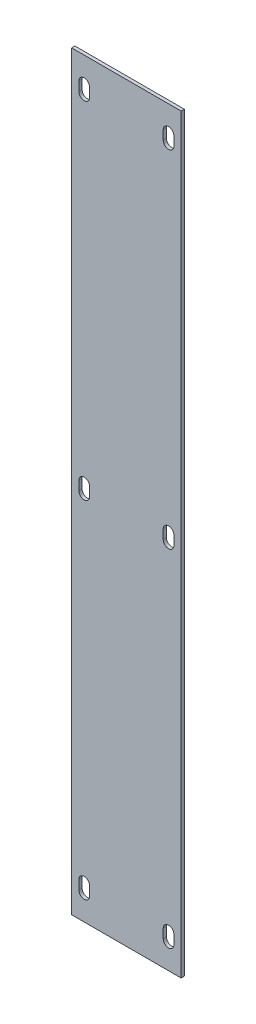
ISO-10303-21;
HEADER;
FILE_DESCRIPTION(('STEP AP214'),'2;1');
FILE_NAME('part.step','',(''),(''),'','','');
FILE_SCHEMA(('AUTOMOTIVE_DESIGN { 1 0 10303 214 1 1 1 1 }'));
ENDSEC;
DATA;
#1=APPLICATION_CONTEXT('core data for automotive mechanical design processes');
#2=APPLICATION_PROTOCOL_DEFINITION('international standard','automotive_design',2000,#1);
#3=PRODUCT_CONTEXT('',#1,'mechanical');
#4=PRODUCT('Part','Part','',(#3));
#5=PRODUCT_RELATED_PRODUCT_CATEGORY('part','',(#4));
#6=PRODUCT_DEFINITION_FORMATION('','',#4);
#7=PRODUCT_DEFINITION_CONTEXT('part definition',#1,'design');
#8=PRODUCT_DEFINITION('design','',#6,#7);
#9=PRODUCT_DEFINITION_SHAPE('','',#8);
#10=(LENGTH_UNIT() NAMED_UNIT(*) SI_UNIT(.MILLI.,.METRE.));
#11=(NAMED_UNIT(*) PLANE_ANGLE_UNIT() SI_UNIT($,.RADIAN.));
#12=(NAMED_UNIT(*) SI_UNIT($,.STERADIAN.) SOLID_ANGLE_UNIT());
#13=UNCERTAINTY_MEASURE_WITH_UNIT(LENGTH_MEASURE(1.E-05),#10,'distance_accuracy_value','');
#14=(GEOMETRIC_REPRESENTATION_CONTEXT(3) GLOBAL_UNCERTAINTY_ASSIGNED_CONTEXT((#13)) GLOBAL_UNIT_ASSIGNED_CONTEXT((#10,
#11,#12)) REPRESENTATION_CONTEXT('',''));
#15=CARTESIAN_POINT('',(0.,0.,0.));
#16=DIRECTION('',(0.,0.,1.));
#17=DIRECTION('',(1.,0.,0.));
#18=AXIS2_PLACEMENT_3D('',#15,#16,#17);
#19=CARTESIAN_POINT('',(-13.85,190.09,-0.4064));
#20=DIRECTION('',(0.,0.,1.));
#21=DIRECTION('',(1.,0.,0.));
#22=AXIS2_PLACEMENT_3D('',#19,#20,#21);
#23=PLANE('',#22);
#24=CARTESIAN_POINT('',(-10.675,8.65,-0.406400000000001));
#25=DIRECTION('',(0.,0.,-1.));
#26=DIRECTION('',(-1.,0.,0.));
#27=AXIS2_PLACEMENT_3D('',#24,#25,#26);
#28=CIRCLE('',#27,1.34999999999999);
#29=CARTESIAN_POINT('',(-12.025,8.65,-0.4064));
#30=VERTEX_POINT('',#29);
#31=CARTESIAN_POINT('',(-9.32500000000002,8.65,-0.406400000000001));
#32=VERTEX_POINT('',#31);
#33=EDGE_CURVE('E734',#30,#32,#28,.T.);
#34=ORIENTED_EDGE('',*,*,#33,.F.);
#35=DIRECTION('',(0.,1.,0.));
#36=VECTOR('',#35,1.);
#37=CARTESIAN_POINT('',(-12.025,6.35,-0.4064));
#38=LINE('',#37,#36);
#39=CARTESIAN_POINT('',(-12.025,6.34999999999999,-0.4064));
#40=VERTEX_POINT('',#39);
#41=EDGE_CURVE('E712',#40,#30,#38,.T.);
#42=ORIENTED_EDGE('',*,*,#41,.F.);
#43=CARTESIAN_POINT('',(-10.675,6.35,-0.406400000000001));
#44=DIRECTION('',(0.,0.,-1.));
#45=DIRECTION('',(-1.,0.,0.));
#46=AXIS2_PLACEMENT_3D('',#43,#44,#45);
#47=CIRCLE('',#46,1.34999999999999);
#48=CARTESIAN_POINT('',(-9.32500000000002,6.35,-0.406400000000001));
#49=VERTEX_POINT('',#48);
#50=EDGE_CURVE('E723',#49,#40,#47,.T.);
#51=ORIENTED_EDGE('',*,*,#50,.F.);
#52=DIRECTION('',(0.,1.,0.));
#53=VECTOR('',#52,1.);
#54=CARTESIAN_POINT('',(-9.32500000000002,6.35,-0.406400000000001));
#55=LINE('',#54,#53);
#56=EDGE_CURVE('E715',#49,#32,#55,.T.);
#57=ORIENTED_EDGE('',*,*,#56,.T.);
#58=EDGE_LOOP('',(#34,#42,#51,#57));
#59=FACE_BOUND('',#58,.T.);
#60=DIRECTION('',(0.,1.,0.));
#61=VECTOR('',#60,1.);
#62=CARTESIAN_POINT('',(-12.025,181.44,-0.4064));
#63=LINE('',#62,#61);
#64=CARTESIAN_POINT('',(-12.025,181.44,-0.406400000000001));
#65=VERTEX_POINT('',#64);
#66=CARTESIAN_POINT('',(-12.025,183.74,-0.4064));
#67=VERTEX_POINT('',#66);
#68=EDGE_CURVE('E768',#65,#67,#63,.T.);
#69=ORIENTED_EDGE('',*,*,#68,.F.);
#70=CARTESIAN_POINT('',(-10.675,181.44,-0.406400000000001));
#71=DIRECTION('',(0.,0.,-1.));
#72=DIRECTION('',(-1.,0.,0.));
#73=AXIS2_PLACEMENT_3D('',#70,#71,#72);
#74=CIRCLE('',#73,1.34999999999999);
#75=CARTESIAN_POINT('',(-9.32500000000002,181.44,-0.406400000000001));
#76=VERTEX_POINT('',#75);
#77=EDGE_CURVE('E779',#76,#65,#74,.T.);
#78=ORIENTED_EDGE('',*,*,#77,.F.);
#79=DIRECTION('',(0.,1.,0.));
#80=VECTOR('',#79,1.);
#81=CARTESIAN_POINT('',(-9.32500000000002,181.44,-0.406400000000001));
#82=LINE('',#81,#80);
#83=CARTESIAN_POINT('',(-9.32500000000002,183.74,-0.406400000000001));
#84=VERTEX_POINT('',#83);
#85=EDGE_CURVE('E771',#76,#84,#82,.T.);
#86=ORIENTED_EDGE('',*,*,#85,.T.);
#87=CARTESIAN_POINT('',(-10.675,183.74,-0.406400000000001));
#88=DIRECTION('',(0.,0.,-1.));
#89=DIRECTION('',(-1.,0.,0.));
#90=AXIS2_PLACEMENT_3D('',#87,#88,#89);
#91=CIRCLE('',#90,1.34999999999999);
#92=EDGE_CURVE('E790',#67,#84,#91,.T.);
#93=ORIENTED_EDGE('',*,*,#92,.F.);
#94=EDGE_LOOP('',(#69,#78,#86,#93));
#95=FACE_BOUND('',#94,.T.);
#96=CARTESIAN_POINT('',(10.675,96.195,-0.406400000000001));
#97=DIRECTION('',(0.,0.,-1.));
#98=DIRECTION('',(-1.,0.,0.));
#99=AXIS2_PLACEMENT_3D('',#96,#97,#98);
#100=CIRCLE('',#99,1.34999999999999);
#101=CARTESIAN_POINT('',(9.32499999999997,96.195,-0.4064));
#102=VERTEX_POINT('',#101);
#103=CARTESIAN_POINT('',(12.025,96.195,-0.406400000000001));
#104=VERTEX_POINT('',#103);
#105=EDGE_CURVE('E818',#102,#104,#100,.T.);
#106=ORIENTED_EDGE('',*,*,#105,.F.);
#107=DIRECTION('',(0.,1.,0.));
#108=VECTOR('',#107,1.);
#109=CARTESIAN_POINT('',(9.32499999999997,93.895,-0.4064));
#110=LINE('',#109,#108);
#111=CARTESIAN_POINT('',(9.32500000000001,93.895,-0.406400000000001));
#112=VERTEX_POINT('',#111);
#113=EDGE_CURVE('E796',#112,#102,#110,.T.);
#114=ORIENTED_EDGE('',*,*,#113,.F.);
#115=CARTESIAN_POINT('',(10.675,93.895,-0.406400000000001));
#116=DIRECTION('',(0.,0.,-1.));
#117=DIRECTION('',(-1.,0.,0.));
#118=AXIS2_PLACEMENT_3D('',#115,#116,#117);
#119=CIRCLE('',#118,1.34999999999999);
#120=CARTESIAN_POINT('',(12.025,93.895,-0.406400000000001));
#121=VERTEX_POINT('',#120);
#122=EDGE_CURVE('E807',#121,#112,#119,.T.);
#123=ORIENTED_EDGE('',*,*,#122,.F.);
#124=DIRECTION('',(0.,1.,0.));
#125=VECTOR('',#124,1.);
#126=CARTESIAN_POINT('',(12.025,93.895,-0.406400000000001));
#127=LINE('',#126,#125);
#128=EDGE_CURVE('E799',#121,#104,#127,.T.);
#129=ORIENTED_EDGE('',*,*,#128,.T.);
#130=EDGE_LOOP('',(#106,#114,#123,#129));
#131=FACE_BOUND('',#130,.T.);
#132=DIRECTION('',(-1.,0.,0.));
#133=VECTOR('',#132,1.);
#134=CARTESIAN_POINT('',(-13.85,0.,-0.4064));
#135=LINE('',#134,#133);
#136=CARTESIAN_POINT('',(13.85,0.,-0.4064));
#137=VERTEX_POINT('',#136);
#138=CARTESIAN_POINT('',(-13.85,0.,-0.4064));
#139=VERTEX_POINT('',#138);
#140=EDGE_CURVE('E872',#137,#139,#135,.T.);
#141=ORIENTED_EDGE('',*,*,#140,.T.);
#142=DIRECTION('',(0.,-1.,0.));
#143=VECTOR('',#142,1.);
#144=CARTESIAN_POINT('',(-13.85,190.09,-0.4064));
#145=LINE('',#144,#143);
#146=CARTESIAN_POINT('',(-13.85,190.09,-0.4064));
#147=VERTEX_POINT('',#146);
#148=EDGE_CURVE('E887',#147,#139,#145,.T.);
#149=ORIENTED_EDGE('',*,*,#148,.F.);
#150=DIRECTION('',(-1.,0.,0.));
#151=VECTOR('',#150,1.);
#152=CARTESIAN_POINT('',(-13.85,190.09,-0.4064));
#153=LINE('',#152,#151);
#154=CARTESIAN_POINT('',(13.85,190.09,-0.4064));
#155=VERTEX_POINT('',#154);
#156=EDGE_CURVE('E858',#155,#147,#153,.T.);
#157=ORIENTED_EDGE('',*,*,#156,.F.);
#158=DIRECTION('',(0.,-1.,0.));
#159=VECTOR('',#158,1.);
#160=CARTESIAN_POINT('',(13.85,190.09,-0.4064));
#161=LINE('',#160,#159);
#162=EDGE_CURVE('E891',#155,#137,#161,.T.);
#163=ORIENTED_EDGE('',*,*,#162,.T.);
#164=EDGE_LOOP('',(#141,#149,#157,#163));
#165=FACE_BOUND('',#164,.T.);
#166=CARTESIAN_POINT('',(-10.675,96.195,-0.406400000000001));
#167=DIRECTION('',(0.,0.,-1.));
#168=DIRECTION('',(-1.,0.,0.));
#169=AXIS2_PLACEMENT_3D('',#166,#167,#168);
#170=CIRCLE('',#169,1.34999999999999);
#171=CARTESIAN_POINT('',(-12.025,96.195,-0.4064));
#172=VERTEX_POINT('',#171);
#173=CARTESIAN_POINT('',(-9.32500000000002,96.195,-0.406400000000001));
#174=VERTEX_POINT('',#173);
#175=EDGE_CURVE('E847',#172,#174,#170,.T.);
#176=ORIENTED_EDGE('',*,*,#175,.F.);
#177=DIRECTION('',(0.,1.,0.));
#178=VECTOR('',#177,1.);
#179=CARTESIAN_POINT('',(-12.025,93.895,-0.4064));
#180=LINE('',#179,#178);
#181=CARTESIAN_POINT('',(-12.025,93.895,-0.406400000000001));
#182=VERTEX_POINT('',#181);
#183=EDGE_CURVE('E825',#182,#172,#180,.T.);
#184=ORIENTED_EDGE('',*,*,#183,.F.);
#185=CARTESIAN_POINT('',(-10.675,93.895,-0.406400000000001));
#186=DIRECTION('',(0.,0.,-1.));
#187=DIRECTION('',(-1.,0.,0.));
#188=AXIS2_PLACEMENT_3D('',#185,#186,#187);
#189=CIRCLE('',#188,1.34999999999999);
#190=CARTESIAN_POINT('',(-9.32500000000002,93.895,-0.406400000000001));
#191=VERTEX_POINT('',#190);
#192=EDGE_CURVE('E836',#191,#182,#189,.T.);
#193=ORIENTED_EDGE('',*,*,#192,.F.);
#194=DIRECTION('',(0.,1.,0.));
#195=VECTOR('',#194,1.);
#196=CARTESIAN_POINT('',(-9.32500000000002,93.895,-0.406400000000001));
#197=LINE('',#196,#195);
#198=EDGE_CURVE('E828',#191,#174,#197,.T.);
#199=ORIENTED_EDGE('',*,*,#198,.T.);
#200=EDGE_LOOP('',(#176,#184,#193,#199));
#201=FACE_BOUND('',#200,.T.);
#202=DIRECTION('',(0.,1.,0.));
#203=VECTOR('',#202,1.);
#204=CARTESIAN_POINT('',(9.32499999999997,181.44,-0.4064));
#205=LINE('',#204,#203);
#206=CARTESIAN_POINT('',(9.325,181.44,-0.406400000000001));
#207=VERTEX_POINT('',#206);
#208=CARTESIAN_POINT('',(9.32499999999997,183.74,-0.4064));
#209=VERTEX_POINT('',#208);
#210=EDGE_CURVE('E740',#207,#209,#205,.T.);
#211=ORIENTED_EDGE('',*,*,#210,.F.);
#212=CARTESIAN_POINT('',(10.675,181.44,-0.406400000000001));
#213=DIRECTION('',(0.,0.,-1.));
#214=DIRECTION('',(-1.,0.,0.));
#215=AXIS2_PLACEMENT_3D('',#212,#213,#214);
#216=CIRCLE('',#215,1.34999999999999);
#217=CARTESIAN_POINT('',(12.025,181.44,-0.406400000000001));
#218=VERTEX_POINT('',#217);
#219=EDGE_CURVE('E751',#218,#207,#216,.T.);
#220=ORIENTED_EDGE('',*,*,#219,.F.);
#221=DIRECTION('',(0.,1.,0.));
#222=VECTOR('',#221,1.);
#223=CARTESIAN_POINT('',(12.025,181.44,-0.406400000000001));
#224=LINE('',#223,#222);
#225=CARTESIAN_POINT('',(12.025,183.74,-0.406400000000001));
#226=VERTEX_POINT('',#225);
#227=EDGE_CURVE('E743',#218,#226,#224,.T.);
#228=ORIENTED_EDGE('',*,*,#227,.T.);
#229=CARTESIAN_POINT('',(10.675,183.74,-0.406400000000001));
#230=DIRECTION('',(0.,0.,-1.));
#231=DIRECTION('',(-1.,0.,0.));
#232=AXIS2_PLACEMENT_3D('',#229,#230,#231);
#233=CIRCLE('',#232,1.34999999999999);
#234=EDGE_CURVE('E762',#209,#226,#233,.T.);
#235=ORIENTED_EDGE('',*,*,#234,.F.);
#236=EDGE_LOOP('',(#211,#220,#228,#235));
#237=FACE_BOUND('',#236,.T.);
#238=DIRECTION('',(0.,1.,0.));
#239=VECTOR('',#238,1.);
#240=CARTESIAN_POINT('',(9.32499999999997,6.35,-0.4064));
#241=LINE('',#240,#239);
#242=CARTESIAN_POINT('',(9.325,6.35,-0.406400000000001));
#243=VERTEX_POINT('',#242);
#244=CARTESIAN_POINT('',(9.32499999999997,8.65,-0.4064));
#245=VERTEX_POINT('',#244);
#246=EDGE_CURVE('E699',#243,#245,#241,.T.);
#247=ORIENTED_EDGE('',*,*,#246,.F.);
#248=CARTESIAN_POINT('',(10.675,6.35,-0.406400000000001));
#249=DIRECTION('',(0.,0.,-1.));
#250=DIRECTION('',(-1.,0.,0.));
#251=AXIS2_PLACEMENT_3D('',#248,#249,#250);
#252=CIRCLE('',#251,1.34999999999999);
#253=CARTESIAN_POINT('',(12.025,6.35,-0.406400000000001));
#254=VERTEX_POINT('',#253);
#255=EDGE_CURVE('E697',#254,#243,#252,.T.);
#256=ORIENTED_EDGE('',*,*,#255,.F.);
#257=DIRECTION('',(0.,1.,0.));
#258=VECTOR('',#257,1.);
#259=CARTESIAN_POINT('',(12.025,6.35,-0.406400000000001));
#260=LINE('',#259,#258);
#261=CARTESIAN_POINT('',(12.025,8.65,-0.406400000000001));
#262=VERTEX_POINT('',#261);
#263=EDGE_CURVE('E692',#254,#262,#260,.T.);
#264=ORIENTED_EDGE('',*,*,#263,.T.);
#265=CARTESIAN_POINT('',(10.675,8.65,-0.406400000000001));
#266=DIRECTION('',(0.,0.,-1.));
#267=DIRECTION('',(-1.,0.,0.));
#268=AXIS2_PLACEMENT_3D('',#265,#266,#267);
#269=CIRCLE('',#268,1.34999999999999);
#270=EDGE_CURVE('E678',#245,#262,#269,.T.);
#271=ORIENTED_EDGE('',*,*,#270,.F.);
#272=EDGE_LOOP('',(#247,#256,#264,#271));
#273=FACE_BOUND('',#272,.T.);
#274=ADVANCED_FACE('F487',(#59,#95,#131,#165,#201,#237,#273),#23,.F.);
#275=CARTESIAN_POINT('',(-13.85,190.09,0.4064));
#276=DIRECTION('',(0.,0.,-1.));
#277=DIRECTION('',(-1.,0.,0.));
#278=AXIS2_PLACEMENT_3D('',#275,#276,#277);
#279=PLANE('',#278);
#280=DIRECTION('',(0.,1.,0.));
#281=VECTOR('',#280,1.);
#282=CARTESIAN_POINT('',(-9.32500000000001,190.09,0.4064));
#283=LINE('',#282,#281);
#284=CARTESIAN_POINT('',(-9.32500000000001,6.35,0.4064));
#285=VERTEX_POINT('',#284);
#286=CARTESIAN_POINT('',(-9.32500000000001,8.65,0.4064));
#287=VERTEX_POINT('',#286);
#288=EDGE_CURVE('E967',#285,#287,#283,.T.);
#289=ORIENTED_EDGE('',*,*,#288,.F.);
#290=CARTESIAN_POINT('',(-10.675,6.35,0.4064));
#291=DIRECTION('',(0.,0.,-1.));
#292=DIRECTION('',(-1.,0.,0.));
#293=AXIS2_PLACEMENT_3D('',#290,#291,#292);
#294=CIRCLE('',#293,1.34999999999999);
#295=CARTESIAN_POINT('',(-12.025,6.35,0.4064));
#296=VERTEX_POINT('',#295);
#297=EDGE_CURVE('E959',#285,#296,#294,.T.);
#298=ORIENTED_EDGE('',*,*,#297,.T.);
#299=DIRECTION('',(0.,1.,0.));
#300=VECTOR('',#299,1.);
#301=CARTESIAN_POINT('',(-12.025,190.09,0.4064));
#302=LINE('',#301,#300);
#303=CARTESIAN_POINT('',(-12.025,8.64999999999999,0.4064));
#304=VERTEX_POINT('',#303);
#305=EDGE_CURVE('E955',#296,#304,#302,.T.);
#306=ORIENTED_EDGE('',*,*,#305,.T.);
#307=CARTESIAN_POINT('',(-10.675,8.65,0.4064));
#308=DIRECTION('',(0.,0.,-1.));
#309=DIRECTION('',(-1.,0.,0.));
#310=AXIS2_PLACEMENT_3D('',#307,#308,#309);
#311=CIRCLE('',#310,1.34999999999999);
#312=EDGE_CURVE('E963',#304,#287,#311,.T.);
#313=ORIENTED_EDGE('',*,*,#312,.T.);
#314=EDGE_LOOP('',(#289,#298,#306,#313));
#315=FACE_BOUND('',#314,.T.);
#316=DIRECTION('',(0.,1.,0.));
#317=VECTOR('',#316,1.);
#318=CARTESIAN_POINT('',(-9.32500000000001,190.09,0.4064));
#319=LINE('',#318,#317);
#320=CARTESIAN_POINT('',(-9.32500000000001,181.44,0.4064));
#321=VERTEX_POINT('',#320);
#322=CARTESIAN_POINT('',(-9.32500000000001,183.74,0.4064));
#323=VERTEX_POINT('',#322);
#324=EDGE_CURVE('E937',#321,#323,#319,.T.);
#325=ORIENTED_EDGE('',*,*,#324,.F.);
#326=CARTESIAN_POINT('',(-10.675,181.44,0.4064));
#327=DIRECTION('',(0.,0.,-1.));
#328=DIRECTION('',(-1.,0.,0.));
#329=AXIS2_PLACEMENT_3D('',#326,#327,#328);
#330=CIRCLE('',#329,1.34999999999999);
#331=CARTESIAN_POINT('',(-12.025,181.44,0.4064));
#332=VERTEX_POINT('',#331);
#333=EDGE_CURVE('E929',#321,#332,#330,.T.);
#334=ORIENTED_EDGE('',*,*,#333,.T.);
#335=DIRECTION('',(0.,1.,0.));
#336=VECTOR('',#335,1.);
#337=CARTESIAN_POINT('',(-12.025,190.09,0.4064));
#338=LINE('',#337,#336);
#339=CARTESIAN_POINT('',(-12.025,183.74,0.4064));
#340=VERTEX_POINT('',#339);
#341=EDGE_CURVE('E925',#332,#340,#338,.T.);
#342=ORIENTED_EDGE('',*,*,#341,.T.);
#343=CARTESIAN_POINT('',(-10.675,183.74,0.4064));
#344=DIRECTION('',(0.,0.,-1.));
#345=DIRECTION('',(-1.,0.,0.));
#346=AXIS2_PLACEMENT_3D('',#343,#344,#345);
#347=CIRCLE('',#346,1.34999999999999);
#348=EDGE_CURVE('E933',#340,#323,#347,.T.);
#349=ORIENTED_EDGE('',*,*,#348,.T.);
#350=EDGE_LOOP('',(#325,#334,#342,#349));
#351=FACE_BOUND('',#350,.T.);
#352=DIRECTION('',(0.,1.,0.));
#353=VECTOR('',#352,1.);
#354=CARTESIAN_POINT('',(-9.325,190.09,0.4064));
#355=LINE('',#354,#353);
#356=CARTESIAN_POINT('',(-9.325,93.895,0.4064));
#357=VERTEX_POINT('',#356);
#358=CARTESIAN_POINT('',(-9.325,96.195,0.4064));
#359=VERTEX_POINT('',#358);
#360=EDGE_CURVE('E907',#357,#359,#355,.T.);
#361=ORIENTED_EDGE('',*,*,#360,.F.);
#362=CARTESIAN_POINT('',(-10.675,93.895,0.4064));
#363=DIRECTION('',(0.,0.,-1.));
#364=DIRECTION('',(-1.,0.,0.));
#365=AXIS2_PLACEMENT_3D('',#362,#363,#364);
#366=CIRCLE('',#365,1.34999999999999);
#367=CARTESIAN_POINT('',(-12.025,93.895,0.4064));
#368=VERTEX_POINT('',#367);
#369=EDGE_CURVE('E899',#357,#368,#366,.T.);
#370=ORIENTED_EDGE('',*,*,#369,.T.);
#371=DIRECTION('',(0.,1.,0.));
#372=VECTOR('',#371,1.);
#373=CARTESIAN_POINT('',(-12.025,190.09,0.4064));
#374=LINE('',#373,#372);
#375=CARTESIAN_POINT('',(-12.025,96.195,0.4064));
#376=VERTEX_POINT('',#375);
#377=EDGE_CURVE('E895',#368,#376,#374,.T.);
#378=ORIENTED_EDGE('',*,*,#377,.T.);
#379=CARTESIAN_POINT('',(-10.675,96.195,0.4064));
#380=DIRECTION('',(0.,0.,-1.));
#381=DIRECTION('',(-1.,0.,0.));
#382=AXIS2_PLACEMENT_3D('',#379,#380,#381);
#383=CIRCLE('',#382,1.34999999999999);
#384=EDGE_CURVE('E903',#376,#359,#383,.T.);
#385=ORIENTED_EDGE('',*,*,#384,.T.);
#386=EDGE_LOOP('',(#361,#370,#378,#385));
#387=FACE_BOUND('',#386,.T.);
#388=DIRECTION('',(1.,0.,0.));
#389=VECTOR('',#388,1.);
#390=CARTESIAN_POINT('',(-13.85,0.,0.4064));
#391=LINE('',#390,#389);
#392=CARTESIAN_POINT('',(-13.85,0.,0.4064));
#393=VERTEX_POINT('',#392);
#394=CARTESIAN_POINT('',(13.85,0.,0.4064));
#395=VERTEX_POINT('',#394);
#396=EDGE_CURVE('E859',#393,#395,#391,.T.);
#397=ORIENTED_EDGE('',*,*,#396,.T.);
#398=DIRECTION('',(0.,-1.,0.));
#399=VECTOR('',#398,1.);
#400=CARTESIAN_POINT('',(13.85,190.09,0.4064));
#401=LINE('',#400,#399);
#402=CARTESIAN_POINT('',(13.85,190.09,0.4064));
#403=VERTEX_POINT('',#402);
#404=EDGE_CURVE('E868',#403,#395,#401,.T.);
#405=ORIENTED_EDGE('',*,*,#404,.F.);
#406=DIRECTION('',(1.,0.,0.));
#407=VECTOR('',#406,1.);
#408=CARTESIAN_POINT('',(-13.85,190.09,0.4064));
#409=LINE('',#408,#407);
#410=CARTESIAN_POINT('',(-13.85,190.09,0.4064));
#411=VERTEX_POINT('',#410);
#412=EDGE_CURVE('E865',#411,#403,#409,.T.);
#413=ORIENTED_EDGE('',*,*,#412,.F.);
#414=DIRECTION('',(0.,-1.,0.));
#415=VECTOR('',#414,1.);
#416=CARTESIAN_POINT('',(-13.85,190.09,0.4064));
#417=LINE('',#416,#415);
#418=EDGE_CURVE('E883',#411,#393,#417,.T.);
#419=ORIENTED_EDGE('',*,*,#418,.T.);
#420=EDGE_LOOP('',(#397,#405,#413,#419));
#421=FACE_BOUND('',#420,.T.);
#422=DIRECTION('',(0.,1.,0.));
#423=VECTOR('',#422,1.);
#424=CARTESIAN_POINT('',(12.025,190.09,0.4064));
#425=LINE('',#424,#423);
#426=CARTESIAN_POINT('',(12.025,93.895,0.4064));
#427=VERTEX_POINT('',#426);
#428=CARTESIAN_POINT('',(12.025,96.195,0.4064));
#429=VERTEX_POINT('',#428);
#430=EDGE_CURVE('E922',#427,#429,#425,.T.);
#431=ORIENTED_EDGE('',*,*,#430,.F.);
#432=CARTESIAN_POINT('',(10.675,93.895,0.4064));
#433=DIRECTION('',(0.,0.,-1.));
#434=DIRECTION('',(-1.,0.,0.));
#435=AXIS2_PLACEMENT_3D('',#432,#433,#434);
#436=CIRCLE('',#435,1.34999999999999);
#437=CARTESIAN_POINT('',(9.32500000000001,93.895,0.4064));
#438=VERTEX_POINT('',#437);
#439=EDGE_CURVE('E914',#427,#438,#436,.T.);
#440=ORIENTED_EDGE('',*,*,#439,.T.);
#441=DIRECTION('',(0.,1.,0.));
#442=VECTOR('',#441,1.);
#443=CARTESIAN_POINT('',(9.32500000000001,190.09,0.4064));
#444=LINE('',#443,#442);
#445=CARTESIAN_POINT('',(9.32500000000001,96.195,0.4064));
#446=VERTEX_POINT('',#445);
#447=EDGE_CURVE('E910',#438,#446,#444,.T.);
#448=ORIENTED_EDGE('',*,*,#447,.T.);
#449=CARTESIAN_POINT('',(10.675,96.195,0.4064));
#450=DIRECTION('',(0.,0.,-1.));
#451=DIRECTION('',(-1.,0.,0.));
#452=AXIS2_PLACEMENT_3D('',#449,#450,#451);
#453=CIRCLE('',#452,1.34999999999999);
#454=EDGE_CURVE('E918',#446,#429,#453,.T.);
#455=ORIENTED_EDGE('',*,*,#454,.T.);
#456=EDGE_LOOP('',(#431,#440,#448,#455));
#457=FACE_BOUND('',#456,.T.);
#458=DIRECTION('',(0.,1.,0.));
#459=VECTOR('',#458,1.);
#460=CARTESIAN_POINT('',(12.025,190.09,0.4064));
#461=LINE('',#460,#459);
#462=CARTESIAN_POINT('',(12.025,181.44,0.4064));
#463=VERTEX_POINT('',#462);
#464=CARTESIAN_POINT('',(12.025,183.74,0.4064));
#465=VERTEX_POINT('',#464);
#466=EDGE_CURVE('E952',#463,#465,#461,.T.);
#467=ORIENTED_EDGE('',*,*,#466,.F.);
#468=CARTESIAN_POINT('',(10.675,181.44,0.4064));
#469=DIRECTION('',(0.,0.,-1.));
#470=DIRECTION('',(-1.,0.,0.));
#471=AXIS2_PLACEMENT_3D('',#468,#469,#470);
#472=CIRCLE('',#471,1.34999999999999);
#473=CARTESIAN_POINT('',(9.32499999999999,181.44,0.4064));
#474=VERTEX_POINT('',#473);
#475=EDGE_CURVE('E944',#463,#474,#472,.T.);
#476=ORIENTED_EDGE('',*,*,#475,.T.);
#477=DIRECTION('',(0.,1.,0.));
#478=VECTOR('',#477,1.);
#479=CARTESIAN_POINT('',(9.32499999999999,190.09,0.4064));
#480=LINE('',#479,#478);
#481=CARTESIAN_POINT('',(9.32499999999999,183.74,0.4064));
#482=VERTEX_POINT('',#481);
#483=EDGE_CURVE('E940',#474,#482,#480,.T.);
#484=ORIENTED_EDGE('',*,*,#483,.T.);
#485=CARTESIAN_POINT('',(10.675,183.74,0.4064));
#486=DIRECTION('',(0.,0.,-1.));
#487=DIRECTION('',(-1.,0.,0.));
#488=AXIS2_PLACEMENT_3D('',#485,#486,#487);
#489=CIRCLE('',#488,1.34999999999999);
#490=EDGE_CURVE('E948',#482,#465,#489,.T.);
#491=ORIENTED_EDGE('',*,*,#490,.T.);
#492=EDGE_LOOP('',(#467,#476,#484,#491));
#493=FACE_BOUND('',#492,.T.);
#494=DIRECTION('',(0.,1.,0.));
#495=VECTOR('',#494,1.);
#496=CARTESIAN_POINT('',(12.025,190.09,0.4064));
#497=LINE('',#496,#495);
#498=CARTESIAN_POINT('',(12.025,6.35,0.4064));
#499=VERTEX_POINT('',#498);
#500=CARTESIAN_POINT('',(12.025,8.65,0.4064));
#501=VERTEX_POINT('',#500);
#502=EDGE_CURVE('E13',#499,#501,#497,.T.);
#503=ORIENTED_EDGE('',*,*,#502,.F.);
#504=CARTESIAN_POINT('',(10.675,6.35,0.4064));
#505=DIRECTION('',(0.,0.,-1.));
#506=DIRECTION('',(-1.,0.,0.));
#507=AXIS2_PLACEMENT_3D('',#504,#505,#506);
#508=CIRCLE('',#507,1.34999999999999);
#509=CARTESIAN_POINT('',(9.325,6.34999999999999,0.4064));
#510=VERTEX_POINT('',#509);
#511=EDGE_CURVE('E974',#499,#510,#508,.T.);
#512=ORIENTED_EDGE('',*,*,#511,.T.);
#513=DIRECTION('',(0.,1.,0.));
#514=VECTOR('',#513,1.);
#515=CARTESIAN_POINT('',(9.325,190.09,0.4064));
#516=LINE('',#515,#514);
#517=CARTESIAN_POINT('',(9.325,8.65,0.4064));
#518=VERTEX_POINT('',#517);
#519=EDGE_CURVE('E970',#510,#518,#516,.T.);
#520=ORIENTED_EDGE('',*,*,#519,.T.);
#521=CARTESIAN_POINT('',(10.675,8.65,0.4064));
#522=DIRECTION('',(0.,0.,-1.));
#523=DIRECTION('',(-1.,0.,0.));
#524=AXIS2_PLACEMENT_3D('',#521,#522,#523);
#525=CIRCLE('',#524,1.34999999999999);
#526=EDGE_CURVE('E496',#518,#501,#525,.T.);
#527=ORIENTED_EDGE('',*,*,#526,.T.);
#528=EDGE_LOOP('',(#503,#512,#520,#527));
#529=FACE_BOUND('',#528,.T.);
#530=ADVANCED_FACE('F979',(#315,#351,#387,#421,#457,#493,#529),#279,.F.);
#531=CARTESIAN_POINT('',(13.85,190.09,0.4064));
#532=DIRECTION('',(-1.,0.,0.));
#533=DIRECTION('',(0.,0.,1.));
#534=AXIS2_PLACEMENT_3D('',#531,#532,#533);
#535=PLANE('',#534);
#536=DIRECTION('',(0.,0.,-1.));
#537=VECTOR('',#536,1.);
#538=CARTESIAN_POINT('',(13.85,0.,0.4064));
#539=LINE('',#538,#537);
#540=EDGE_CURVE('E853',#395,#137,#539,.T.);
#541=ORIENTED_EDGE('',*,*,#540,.T.);
#542=ORIENTED_EDGE('',*,*,#162,.F.);
#543=DIRECTION('',(0.,0.,-1.));
#544=VECTOR('',#543,1.);
#545=CARTESIAN_POINT('',(13.85,190.09,0.4064));
#546=LINE('',#545,#544);
#547=EDGE_CURVE('E854',#403,#155,#546,.T.);
#548=ORIENTED_EDGE('',*,*,#547,.F.);
#549=ORIENTED_EDGE('',*,*,#404,.T.);
#550=EDGE_LOOP('',(#541,#542,#548,#549));
#551=FACE_BOUND('',#550,.T.);
#552=ADVANCED_FACE('F489',(#551),#535,.F.);
#553=CARTESIAN_POINT('',(-13.85,190.09,0.4064));
#554=DIRECTION('',(1.,0.,0.));
#555=DIRECTION('',(0.,0.,-1.));
#556=AXIS2_PLACEMENT_3D('',#553,#554,#555);
#557=PLANE('',#556);
#558=DIRECTION('',(0.,0.,1.));
#559=VECTOR('',#558,1.);
#560=CARTESIAN_POINT('',(-13.85,0.,0.4064));
#561=LINE('',#560,#559);
#562=EDGE_CURVE('E875',#139,#393,#561,.T.);
#563=ORIENTED_EDGE('',*,*,#562,.T.);
#564=ORIENTED_EDGE('',*,*,#418,.F.);
#565=DIRECTION('',(0.,0.,1.));
#566=VECTOR('',#565,1.);
#567=CARTESIAN_POINT('',(-13.85,190.09,0.4064));
#568=LINE('',#567,#566);
#569=EDGE_CURVE('E862',#147,#411,#568,.T.);
#570=ORIENTED_EDGE('',*,*,#569,.F.);
#571=ORIENTED_EDGE('',*,*,#148,.T.);
#572=EDGE_LOOP('',(#563,#564,#570,#571));
#573=FACE_BOUND('',#572,.T.);
#574=ADVANCED_FACE('F1002',(#573),#557,.F.);
#575=CARTESIAN_POINT('',(0.,190.09,0.));
#576=DIRECTION('',(0.,-1.,0.));
#577=DIRECTION('',(0.,0.,-1.));
#578=AXIS2_PLACEMENT_3D('',#575,#576,#577);
#579=PLANE('',#578);
#580=ORIENTED_EDGE('',*,*,#547,.T.);
#581=ORIENTED_EDGE('',*,*,#156,.T.);
#582=ORIENTED_EDGE('',*,*,#569,.T.);
#583=ORIENTED_EDGE('',*,*,#412,.T.);
#584=EDGE_LOOP('',(#580,#581,#582,#583));
#585=FACE_BOUND('',#584,.T.);
#586=ADVANCED_FACE('F1004',(#585),#579,.F.);
#587=CARTESIAN_POINT('',(0.,0.,0.));
#588=DIRECTION('',(0.,-1.,0.));
#589=DIRECTION('',(0.,0.,-1.));
#590=AXIS2_PLACEMENT_3D('',#587,#588,#589);
#591=PLANE('',#590);
#592=ORIENTED_EDGE('',*,*,#540,.F.);
#593=ORIENTED_EDGE('',*,*,#396,.F.);
#594=ORIENTED_EDGE('',*,*,#562,.F.);
#595=ORIENTED_EDGE('',*,*,#140,.F.);
#596=EDGE_LOOP('',(#592,#593,#594,#595));
#597=FACE_BOUND('',#596,.T.);
#598=ADVANCED_FACE('F1007',(#597),#591,.T.);
#599=CARTESIAN_POINT('',(-10.675,96.195,-0.4064));
#600=DIRECTION('',(0.,0.,-1.));
#601=DIRECTION('',(-1.,0.,0.));
#602=AXIS2_PLACEMENT_3D('',#599,#600,#601);
#603=CYLINDRICAL_SURFACE('',#602,1.34999999999999);
#604=DIRECTION('',(0.,0.,-1.));
#605=VECTOR('',#604,1.);
#606=CARTESIAN_POINT('',(-12.025,96.195,-0.4064));
#607=LINE('',#606,#605);
#608=EDGE_CURVE('E850',#172,#376,#607,.F.);
#609=ORIENTED_EDGE('',*,*,#608,.F.);
#610=ORIENTED_EDGE('',*,*,#175,.T.);
#611=DIRECTION('',(0.,0.,1.));
#612=VECTOR('',#611,1.);
#613=CARTESIAN_POINT('',(-9.325,96.195,0.4074));
#614=LINE('',#613,#612);
#615=EDGE_CURVE('E843',#174,#359,#614,.T.);
#616=ORIENTED_EDGE('',*,*,#615,.T.);
#617=ORIENTED_EDGE('',*,*,#384,.F.);
#618=EDGE_LOOP('',(#609,#610,#616,#617));
#619=FACE_BOUND('',#618,.T.);
#620=ADVANCED_FACE('F1010',(#619),#603,.F.);
#621=CARTESIAN_POINT('',(-10.675,93.895,-0.4064));
#622=DIRECTION('',(0.,0.,-1.));
#623=DIRECTION('',(-1.,0.,0.));
#624=AXIS2_PLACEMENT_3D('',#621,#622,#623);
#625=CYLINDRICAL_SURFACE('',#624,1.34999999999999);
#626=DIRECTION('',(0.,0.,1.));
#627=VECTOR('',#626,1.);
#628=CARTESIAN_POINT('',(-9.325,93.895,0.4074));
#629=LINE('',#628,#627);
#630=EDGE_CURVE('E832',#191,#357,#629,.T.);
#631=ORIENTED_EDGE('',*,*,#630,.F.);
#632=ORIENTED_EDGE('',*,*,#192,.T.);
#633=DIRECTION('',(0.,0.,-1.));
#634=VECTOR('',#633,1.);
#635=CARTESIAN_POINT('',(-12.025,93.895,-0.4064));
#636=LINE('',#635,#634);
#637=EDGE_CURVE('E840',#368,#182,#636,.T.);
#638=ORIENTED_EDGE('',*,*,#637,.F.);
#639=ORIENTED_EDGE('',*,*,#369,.F.);
#640=EDGE_LOOP('',(#631,#632,#638,#639));
#641=FACE_BOUND('',#640,.T.);
#642=ADVANCED_FACE('F1017',(#641),#625,.F.);
#643=CARTESIAN_POINT('',(-9.325,93.895,0.4074));
#644=DIRECTION('',(-1.,0.,0.));
#645=DIRECTION('',(0.,0.,1.));
#646=AXIS2_PLACEMENT_3D('',#643,#644,#645);
#647=PLANE('',#646);
#648=ORIENTED_EDGE('',*,*,#360,.T.);
#649=ORIENTED_EDGE('',*,*,#615,.F.);
#650=ORIENTED_EDGE('',*,*,#198,.F.);
#651=ORIENTED_EDGE('',*,*,#630,.T.);
#652=EDGE_LOOP('',(#648,#649,#650,#651));
#653=FACE_BOUND('',#652,.T.);
#654=ADVANCED_FACE('F1021',(#653),#647,.T.);
#655=CARTESIAN_POINT('',(-12.025,93.895,-0.4064));
#656=DIRECTION('',(-1.,0.,0.));
#657=DIRECTION('',(0.,0.,1.));
#658=AXIS2_PLACEMENT_3D('',#655,#656,#657);
#659=PLANE('',#658);
#660=ORIENTED_EDGE('',*,*,#637,.T.);
#661=ORIENTED_EDGE('',*,*,#183,.T.);
#662=ORIENTED_EDGE('',*,*,#608,.T.);
#663=ORIENTED_EDGE('',*,*,#377,.F.);
#664=EDGE_LOOP('',(#660,#661,#662,#663));
#665=FACE_BOUND('',#664,.T.);
#666=ADVANCED_FACE('F1025',(#665),#659,.F.);
#667=CARTESIAN_POINT('',(10.675,96.195,-0.4064));
#668=DIRECTION('',(0.,0.,-1.));
#669=DIRECTION('',(-1.,0.,0.));
#670=AXIS2_PLACEMENT_3D('',#667,#668,#669);
#671=CYLINDRICAL_SURFACE('',#670,1.34999999999999);
#672=DIRECTION('',(0.,0.,-1.));
#673=VECTOR('',#672,1.);
#674=CARTESIAN_POINT('',(9.32500000000001,96.195,-0.4064));
#675=LINE('',#674,#673);
#676=EDGE_CURVE('E821',#102,#446,#675,.F.);
#677=ORIENTED_EDGE('',*,*,#676,.F.);
#678=ORIENTED_EDGE('',*,*,#105,.T.);
#679=DIRECTION('',(0.,0.,1.));
#680=VECTOR('',#679,1.);
#681=CARTESIAN_POINT('',(12.025,96.195,0.4074));
#682=LINE('',#681,#680);
#683=EDGE_CURVE('E814',#104,#429,#682,.T.);
#684=ORIENTED_EDGE('',*,*,#683,.T.);
#685=ORIENTED_EDGE('',*,*,#454,.F.);
#686=EDGE_LOOP('',(#677,#678,#684,#685));
#687=FACE_BOUND('',#686,.T.);
#688=ADVANCED_FACE('F1029',(#687),#671,.F.);
#689=CARTESIAN_POINT('',(10.675,93.895,-0.4064));
#690=DIRECTION('',(0.,0.,-1.));
#691=DIRECTION('',(-1.,0.,0.));
#692=AXIS2_PLACEMENT_3D('',#689,#690,#691);
#693=CYLINDRICAL_SURFACE('',#692,1.34999999999999);
#694=DIRECTION('',(0.,0.,1.));
#695=VECTOR('',#694,1.);
#696=CARTESIAN_POINT('',(12.025,93.895,0.4074));
#697=LINE('',#696,#695);
#698=EDGE_CURVE('E803',#121,#427,#697,.T.);
#699=ORIENTED_EDGE('',*,*,#698,.F.);
#700=ORIENTED_EDGE('',*,*,#122,.T.);
#701=DIRECTION('',(0.,0.,-1.));
#702=VECTOR('',#701,1.);
#703=CARTESIAN_POINT('',(9.32500000000001,93.895,-0.4064));
#704=LINE('',#703,#702);
#705=EDGE_CURVE('E811',#438,#112,#704,.T.);
#706=ORIENTED_EDGE('',*,*,#705,.F.);
#707=ORIENTED_EDGE('',*,*,#439,.F.);
#708=EDGE_LOOP('',(#699,#700,#706,#707));
#709=FACE_BOUND('',#708,.T.);
#710=ADVANCED_FACE('F1033',(#709),#693,.F.);
#711=CARTESIAN_POINT('',(12.025,93.895,0.4074));
#712=DIRECTION('',(-1.,0.,0.));
#713=DIRECTION('',(0.,0.,1.));
#714=AXIS2_PLACEMENT_3D('',#711,#712,#713);
#715=PLANE('',#714);
#716=ORIENTED_EDGE('',*,*,#430,.T.);
#717=ORIENTED_EDGE('',*,*,#683,.F.);
#718=ORIENTED_EDGE('',*,*,#128,.F.);
#719=ORIENTED_EDGE('',*,*,#698,.T.);
#720=EDGE_LOOP('',(#716,#717,#718,#719));
#721=FACE_BOUND('',#720,.T.);
#722=ADVANCED_FACE('F1037',(#721),#715,.T.);
#723=CARTESIAN_POINT('',(9.32500000000001,93.895,-0.4064));
#724=DIRECTION('',(-1.,0.,0.));
#725=DIRECTION('',(0.,0.,1.));
#726=AXIS2_PLACEMENT_3D('',#723,#724,#725);
#727=PLANE('',#726);
#728=ORIENTED_EDGE('',*,*,#705,.T.);
#729=ORIENTED_EDGE('',*,*,#113,.T.);
#730=ORIENTED_EDGE('',*,*,#676,.T.);
#731=ORIENTED_EDGE('',*,*,#447,.F.);
#732=EDGE_LOOP('',(#728,#729,#730,#731));
#733=FACE_BOUND('',#732,.T.);
#734=ADVANCED_FACE('F1041',(#733),#727,.F.);
#735=CARTESIAN_POINT('',(-10.675,183.74,-0.4064));
#736=DIRECTION('',(0.,0.,-1.));
#737=DIRECTION('',(-1.,0.,0.));
#738=AXIS2_PLACEMENT_3D('',#735,#736,#737);
#739=CYLINDRICAL_SURFACE('',#738,1.34999999999999);
#740=DIRECTION('',(0.,0.,-1.));
#741=VECTOR('',#740,1.);
#742=CARTESIAN_POINT('',(-12.025,183.74,-0.4064));
#743=LINE('',#742,#741);
#744=EDGE_CURVE('E793',#67,#340,#743,.F.);
#745=ORIENTED_EDGE('',*,*,#744,.F.);
#746=ORIENTED_EDGE('',*,*,#92,.T.);
#747=DIRECTION('',(0.,0.,1.));
#748=VECTOR('',#747,1.);
#749=CARTESIAN_POINT('',(-9.32500000000001,183.74,0.4074));
#750=LINE('',#749,#748);
#751=EDGE_CURVE('E786',#84,#323,#750,.T.);
#752=ORIENTED_EDGE('',*,*,#751,.T.);
#753=ORIENTED_EDGE('',*,*,#348,.F.);
#754=EDGE_LOOP('',(#745,#746,#752,#753));
#755=FACE_BOUND('',#754,.T.);
#756=ADVANCED_FACE('F1045',(#755),#739,.F.);
#757=CARTESIAN_POINT('',(-10.675,181.44,-0.4064));
#758=DIRECTION('',(0.,0.,-1.));
#759=DIRECTION('',(-1.,0.,0.));
#760=AXIS2_PLACEMENT_3D('',#757,#758,#759);
#761=CYLINDRICAL_SURFACE('',#760,1.34999999999999);
#762=DIRECTION('',(0.,0.,1.));
#763=VECTOR('',#762,1.);
#764=CARTESIAN_POINT('',(-9.32500000000001,181.44,0.4074));
#765=LINE('',#764,#763);
#766=EDGE_CURVE('E775',#76,#321,#765,.T.);
#767=ORIENTED_EDGE('',*,*,#766,.F.);
#768=ORIENTED_EDGE('',*,*,#77,.T.);
#769=DIRECTION('',(0.,0.,-1.));
#770=VECTOR('',#769,1.);
#771=CARTESIAN_POINT('',(-12.025,181.44,-0.4064));
#772=LINE('',#771,#770);
#773=EDGE_CURVE('E783',#332,#65,#772,.T.);
#774=ORIENTED_EDGE('',*,*,#773,.F.);
#775=ORIENTED_EDGE('',*,*,#333,.F.);
#776=EDGE_LOOP('',(#767,#768,#774,#775));
#777=FACE_BOUND('',#776,.T.);
#778=ADVANCED_FACE('F1049',(#777),#761,.F.);
#779=CARTESIAN_POINT('',(-9.32500000000001,181.44,0.4074));
#780=DIRECTION('',(-1.,0.,0.));
#781=DIRECTION('',(0.,0.,1.));
#782=AXIS2_PLACEMENT_3D('',#779,#780,#781);
#783=PLANE('',#782);
#784=ORIENTED_EDGE('',*,*,#324,.T.);
#785=ORIENTED_EDGE('',*,*,#751,.F.);
#786=ORIENTED_EDGE('',*,*,#85,.F.);
#787=ORIENTED_EDGE('',*,*,#766,.T.);
#788=EDGE_LOOP('',(#784,#785,#786,#787));
#789=FACE_BOUND('',#788,.T.);
#790=ADVANCED_FACE('F1053',(#789),#783,.T.);
#791=CARTESIAN_POINT('',(-12.025,181.44,-0.4064));
#792=DIRECTION('',(-1.,0.,0.));
#793=DIRECTION('',(0.,0.,1.));
#794=AXIS2_PLACEMENT_3D('',#791,#792,#793);
#795=PLANE('',#794);
#796=ORIENTED_EDGE('',*,*,#773,.T.);
#797=ORIENTED_EDGE('',*,*,#68,.T.);
#798=ORIENTED_EDGE('',*,*,#744,.T.);
#799=ORIENTED_EDGE('',*,*,#341,.F.);
#800=EDGE_LOOP('',(#796,#797,#798,#799));
#801=FACE_BOUND('',#800,.T.);
#802=ADVANCED_FACE('F1057',(#801),#795,.F.);
#803=CARTESIAN_POINT('',(10.675,183.74,-0.4064));
#804=DIRECTION('',(0.,0.,-1.));
#805=DIRECTION('',(-1.,0.,0.));
#806=AXIS2_PLACEMENT_3D('',#803,#804,#805);
#807=CYLINDRICAL_SURFACE('',#806,1.34999999999999);
#808=DIRECTION('',(0.,0.,-1.));
#809=VECTOR('',#808,1.);
#810=CARTESIAN_POINT('',(9.32499999999999,183.74,-0.4064));
#811=LINE('',#810,#809);
#812=EDGE_CURVE('E765',#209,#482,#811,.F.);
#813=ORIENTED_EDGE('',*,*,#812,.F.);
#814=ORIENTED_EDGE('',*,*,#234,.T.);
#815=DIRECTION('',(0.,0.,1.));
#816=VECTOR('',#815,1.);
#817=CARTESIAN_POINT('',(12.025,183.74,0.4074));
#818=LINE('',#817,#816);
#819=EDGE_CURVE('E758',#226,#465,#818,.T.);
#820=ORIENTED_EDGE('',*,*,#819,.T.);
#821=ORIENTED_EDGE('',*,*,#490,.F.);
#822=EDGE_LOOP('',(#813,#814,#820,#821));
#823=FACE_BOUND('',#822,.T.);
#824=ADVANCED_FACE('F1061',(#823),#807,.F.);
#825=CARTESIAN_POINT('',(10.675,181.44,-0.4064));
#826=DIRECTION('',(0.,0.,-1.));
#827=DIRECTION('',(-1.,0.,0.));
#828=AXIS2_PLACEMENT_3D('',#825,#826,#827);
#829=CYLINDRICAL_SURFACE('',#828,1.34999999999999);
#830=DIRECTION('',(0.,0.,1.));
#831=VECTOR('',#830,1.);
#832=CARTESIAN_POINT('',(12.025,181.44,0.4074));
#833=LINE('',#832,#831);
#834=EDGE_CURVE('E747',#218,#463,#833,.T.);
#835=ORIENTED_EDGE('',*,*,#834,.F.);
#836=ORIENTED_EDGE('',*,*,#219,.T.);
#837=DIRECTION('',(0.,0.,-1.));
#838=VECTOR('',#837,1.);
#839=CARTESIAN_POINT('',(9.32499999999999,181.44,-0.4064));
#840=LINE('',#839,#838);
#841=EDGE_CURVE('E755',#474,#207,#840,.T.);
#842=ORIENTED_EDGE('',*,*,#841,.F.);
#843=ORIENTED_EDGE('',*,*,#475,.F.);
#844=EDGE_LOOP('',(#835,#836,#842,#843));
#845=FACE_BOUND('',#844,.T.);
#846=ADVANCED_FACE('F1065',(#845),#829,.F.);
#847=CARTESIAN_POINT('',(12.025,181.44,0.4074));
#848=DIRECTION('',(-1.,0.,0.));
#849=DIRECTION('',(0.,0.,1.));
#850=AXIS2_PLACEMENT_3D('',#847,#848,#849);
#851=PLANE('',#850);
#852=ORIENTED_EDGE('',*,*,#466,.T.);
#853=ORIENTED_EDGE('',*,*,#819,.F.);
#854=ORIENTED_EDGE('',*,*,#227,.F.);
#855=ORIENTED_EDGE('',*,*,#834,.T.);
#856=EDGE_LOOP('',(#852,#853,#854,#855));
#857=FACE_BOUND('',#856,.T.);
#858=ADVANCED_FACE('F1069',(#857),#851,.T.);
#859=CARTESIAN_POINT('',(9.32499999999999,181.44,-0.4064));
#860=DIRECTION('',(-1.,0.,0.));
#861=DIRECTION('',(0.,0.,1.));
#862=AXIS2_PLACEMENT_3D('',#859,#860,#861);
#863=PLANE('',#862);
#864=ORIENTED_EDGE('',*,*,#841,.T.);
#865=ORIENTED_EDGE('',*,*,#210,.T.);
#866=ORIENTED_EDGE('',*,*,#812,.T.);
#867=ORIENTED_EDGE('',*,*,#483,.F.);
#868=EDGE_LOOP('',(#864,#865,#866,#867));
#869=FACE_BOUND('',#868,.T.);
#870=ADVANCED_FACE('F1073',(#869),#863,.F.);
#871=CARTESIAN_POINT('',(-10.675,8.65,-0.4064));
#872=DIRECTION('',(0.,0.,-1.));
#873=DIRECTION('',(-1.,0.,0.));
#874=AXIS2_PLACEMENT_3D('',#871,#872,#873);
#875=CYLINDRICAL_SURFACE('',#874,1.34999999999999);
#876=DIRECTION('',(0.,0.,-1.));
#877=VECTOR('',#876,1.);
#878=CARTESIAN_POINT('',(-12.025,8.65,-0.4064));
#879=LINE('',#878,#877);
#880=EDGE_CURVE('E737',#30,#304,#879,.F.);
#881=ORIENTED_EDGE('',*,*,#880,.F.);
#882=ORIENTED_EDGE('',*,*,#33,.T.);
#883=DIRECTION('',(0.,0.,1.));
#884=VECTOR('',#883,1.);
#885=CARTESIAN_POINT('',(-9.32500000000001,8.65,0.4074));
#886=LINE('',#885,#884);
#887=EDGE_CURVE('E730',#32,#287,#886,.T.);
#888=ORIENTED_EDGE('',*,*,#887,.T.);
#889=ORIENTED_EDGE('',*,*,#312,.F.);
#890=EDGE_LOOP('',(#881,#882,#888,#889));
#891=FACE_BOUND('',#890,.T.);
#892=ADVANCED_FACE('F1077',(#891),#875,.F.);
#893=CARTESIAN_POINT('',(-10.675,6.35,-0.4064));
#894=DIRECTION('',(0.,0.,-1.));
#895=DIRECTION('',(-1.,0.,0.));
#896=AXIS2_PLACEMENT_3D('',#893,#894,#895);
#897=CYLINDRICAL_SURFACE('',#896,1.34999999999999);
#898=DIRECTION('',(0.,0.,1.));
#899=VECTOR('',#898,1.);
#900=CARTESIAN_POINT('',(-9.32500000000001,6.35,0.4074));
#901=LINE('',#900,#899);
#902=EDGE_CURVE('E719',#49,#285,#901,.T.);
#903=ORIENTED_EDGE('',*,*,#902,.F.);
#904=ORIENTED_EDGE('',*,*,#50,.T.);
#905=DIRECTION('',(0.,0.,-1.));
#906=VECTOR('',#905,1.);
#907=CARTESIAN_POINT('',(-12.025,6.35,-0.4064));
#908=LINE('',#907,#906);
#909=EDGE_CURVE('E726',#296,#40,#908,.T.);
#910=ORIENTED_EDGE('',*,*,#909,.F.);
#911=ORIENTED_EDGE('',*,*,#297,.F.);
#912=EDGE_LOOP('',(#903,#904,#910,#911));
#913=FACE_BOUND('',#912,.T.);
#914=ADVANCED_FACE('F1081',(#913),#897,.F.);
#915=CARTESIAN_POINT('',(-9.32500000000001,6.35,0.4074));
#916=DIRECTION('',(-1.,0.,0.));
#917=DIRECTION('',(0.,0.,1.));
#918=AXIS2_PLACEMENT_3D('',#915,#916,#917);
#919=PLANE('',#918);
#920=ORIENTED_EDGE('',*,*,#288,.T.);
#921=ORIENTED_EDGE('',*,*,#887,.F.);
#922=ORIENTED_EDGE('',*,*,#56,.F.);
#923=ORIENTED_EDGE('',*,*,#902,.T.);
#924=EDGE_LOOP('',(#920,#921,#922,#923));
#925=FACE_BOUND('',#924,.T.);
#926=ADVANCED_FACE('F1085',(#925),#919,.T.);
#927=CARTESIAN_POINT('',(-12.025,6.35,-0.4064));
#928=DIRECTION('',(-1.,0.,0.));
#929=DIRECTION('',(0.,0.,1.));
#930=AXIS2_PLACEMENT_3D('',#927,#928,#929);
#931=PLANE('',#930);
#932=ORIENTED_EDGE('',*,*,#909,.T.);
#933=ORIENTED_EDGE('',*,*,#41,.T.);
#934=ORIENTED_EDGE('',*,*,#880,.T.);
#935=ORIENTED_EDGE('',*,*,#305,.F.);
#936=EDGE_LOOP('',(#932,#933,#934,#935));
#937=FACE_BOUND('',#936,.T.);
#938=ADVANCED_FACE('F990',(#937),#931,.F.);
#939=CARTESIAN_POINT('',(10.675,8.65,-0.4064));
#940=DIRECTION('',(0.,0.,-1.));
#941=DIRECTION('',(-1.,0.,0.));
#942=AXIS2_PLACEMENT_3D('',#939,#940,#941);
#943=CYLINDRICAL_SURFACE('',#942,1.34999999999999);
#944=DIRECTION('',(0.,0.,-1.));
#945=VECTOR('',#944,1.);
#946=CARTESIAN_POINT('',(9.325,8.65,-0.4064));
#947=LINE('',#946,#945);
#948=EDGE_CURVE('E684',#245,#518,#947,.F.);
#949=ORIENTED_EDGE('',*,*,#948,.F.);
#950=ORIENTED_EDGE('',*,*,#270,.T.);
#951=DIRECTION('',(0.,0.,1.));
#952=VECTOR('',#951,1.);
#953=CARTESIAN_POINT('',(12.025,8.65,0.4074));
#954=LINE('',#953,#952);
#955=EDGE_CURVE('E681',#262,#501,#954,.T.);
#956=ORIENTED_EDGE('',*,*,#955,.T.);
#957=ORIENTED_EDGE('',*,*,#526,.F.);
#958=EDGE_LOOP('',(#949,#950,#956,#957));
#959=FACE_BOUND('',#958,.T.);
#960=ADVANCED_FACE('F680',(#959),#943,.F.);
#961=CARTESIAN_POINT('',(10.675,6.35,-0.4064));
#962=DIRECTION('',(0.,0.,-1.));
#963=DIRECTION('',(-1.,0.,0.));
#964=AXIS2_PLACEMENT_3D('',#961,#962,#963);
#965=CYLINDRICAL_SURFACE('',#964,1.34999999999999);
#966=DIRECTION('',(0.,0.,1.));
#967=VECTOR('',#966,1.);
#968=CARTESIAN_POINT('',(12.025,6.35,0.4074));
#969=LINE('',#968,#967);
#970=EDGE_CURVE('E503',#254,#499,#969,.T.);
#971=ORIENTED_EDGE('',*,*,#970,.F.);
#972=ORIENTED_EDGE('',*,*,#255,.T.);
#973=DIRECTION('',(0.,0.,-1.));
#974=VECTOR('',#973,1.);
#975=CARTESIAN_POINT('',(9.325,6.35,-0.4064));
#976=LINE('',#975,#974);
#977=EDGE_CURVE('E508',#510,#243,#976,.T.);
#978=ORIENTED_EDGE('',*,*,#977,.F.);
#979=ORIENTED_EDGE('',*,*,#511,.F.);
#980=EDGE_LOOP('',(#971,#972,#978,#979));
#981=FACE_BOUND('',#980,.T.);
#982=ADVANCED_FACE('F982',(#981),#965,.F.);
#983=CARTESIAN_POINT('',(12.025,6.35,0.4074));
#984=DIRECTION('',(-1.,0.,0.));
#985=DIRECTION('',(0.,0.,1.));
#986=AXIS2_PLACEMENT_3D('',#983,#984,#985);
#987=PLANE('',#986);
#988=ORIENTED_EDGE('',*,*,#502,.T.);
#989=ORIENTED_EDGE('',*,*,#955,.F.);
#990=ORIENTED_EDGE('',*,*,#263,.F.);
#991=ORIENTED_EDGE('',*,*,#970,.T.);
#992=EDGE_LOOP('',(#988,#989,#990,#991));
#993=FACE_BOUND('',#992,.T.);
#994=ADVANCED_FACE('F691',(#993),#987,.T.);
#995=CARTESIAN_POINT('',(9.325,6.35,-0.4064));
#996=DIRECTION('',(-1.,0.,0.));
#997=DIRECTION('',(0.,0.,1.));
#998=AXIS2_PLACEMENT_3D('',#995,#996,#997);
#999=PLANE('',#998);
#1000=ORIENTED_EDGE('',*,*,#977,.T.);
#1001=ORIENTED_EDGE('',*,*,#246,.T.);
#1002=ORIENTED_EDGE('',*,*,#948,.T.);
#1003=ORIENTED_EDGE('',*,*,#519,.F.);
#1004=EDGE_LOOP('',(#1000,#1001,#1002,#1003));
#1005=FACE_BOUND('',#1004,.T.);
#1006=ADVANCED_FACE('F981',(#1005),#999,.F.);
#1007=CLOSED_SHELL('',(#274,#530,#552,#574,#586,#598,#620,#642,#654,#666,#688,#710,#722,#734,
#756,#778,#790,#802,#824,#846,#858,#870,#892,#914,#926,#938,#960,#982,#994,#1006));
#1008=MANIFOLD_SOLID_BREP('B2',#1007);
#1009=ADVANCED_BREP_SHAPE_REPRESENTATION('',(#18,#1008),#14);
#1010=SHAPE_DEFINITION_REPRESENTATION(#9,#1009);
ENDSEC;
END-ISO-10303-21;
